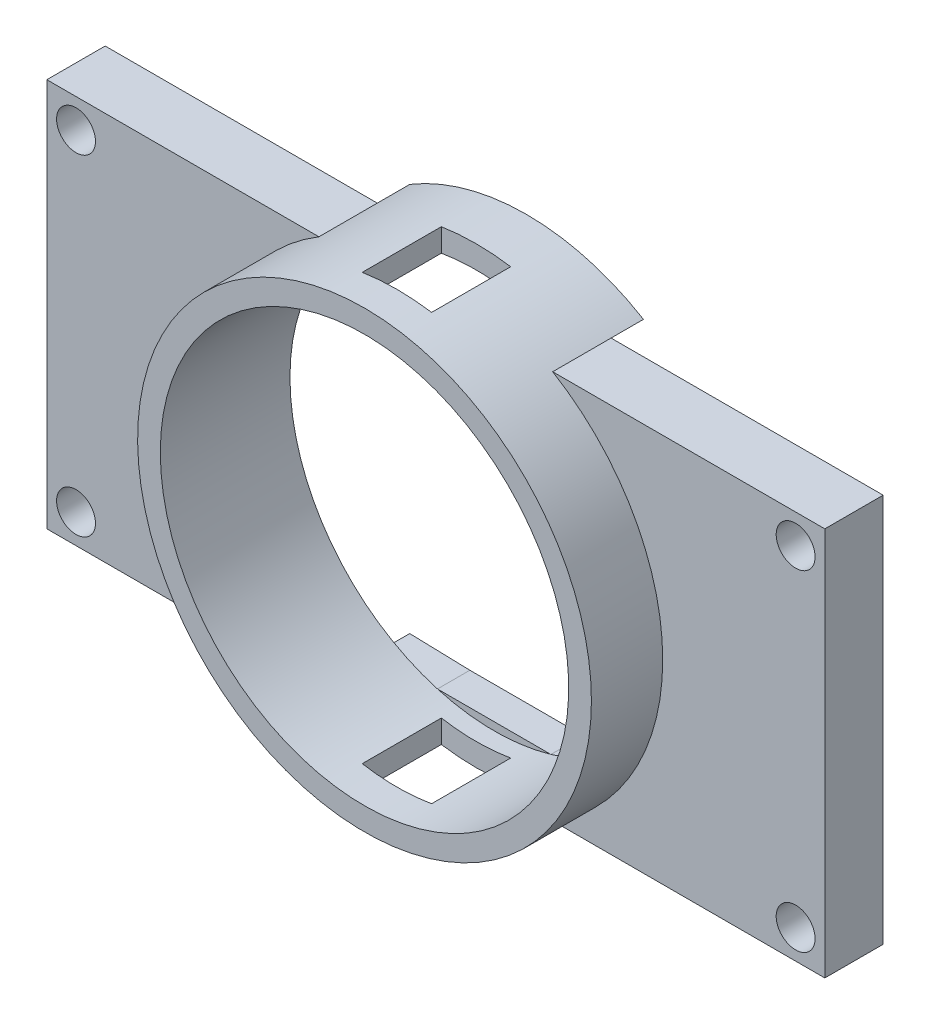
ISO-10303-21;
HEADER;
FILE_DESCRIPTION(('STEP AP214'),'2;1');
FILE_NAME('part.step','',(''),(''),'','','');
FILE_SCHEMA(('AUTOMOTIVE_DESIGN { 1 0 10303 214 1 1 1 1 }'));
ENDSEC;
DATA;
#1=APPLICATION_CONTEXT('core data for automotive mechanical design processes');
#2=APPLICATION_PROTOCOL_DEFINITION('international standard','automotive_design',2000,#1);
#3=PRODUCT_CONTEXT('',#1,'mechanical');
#4=PRODUCT('Part','Part','',(#3));
#5=PRODUCT_RELATED_PRODUCT_CATEGORY('part','',(#4));
#6=PRODUCT_DEFINITION_FORMATION('','',#4);
#7=PRODUCT_DEFINITION_CONTEXT('part definition',#1,'design');
#8=PRODUCT_DEFINITION('design','',#6,#7);
#9=PRODUCT_DEFINITION_SHAPE('','',#8);
#10=(LENGTH_UNIT() NAMED_UNIT(*) SI_UNIT(.MILLI.,.METRE.));
#11=(NAMED_UNIT(*) PLANE_ANGLE_UNIT() SI_UNIT($,.RADIAN.));
#12=(NAMED_UNIT(*) SI_UNIT($,.STERADIAN.) SOLID_ANGLE_UNIT());
#13=UNCERTAINTY_MEASURE_WITH_UNIT(LENGTH_MEASURE(1.E-05),#10,'distance_accuracy_value','');
#14=(GEOMETRIC_REPRESENTATION_CONTEXT(3) GLOBAL_UNCERTAINTY_ASSIGNED_CONTEXT((#13)) GLOBAL_UNIT_ASSIGNED_CONTEXT((#10,
#11,#12)) REPRESENTATION_CONTEXT('',''));
#15=CARTESIAN_POINT('',(0.,0.,0.));
#16=DIRECTION('',(0.,0.,1.));
#17=DIRECTION('',(1.,0.,0.));
#18=AXIS2_PLACEMENT_3D('',#15,#16,#17);
#19=CARTESIAN_POINT('',(1.90004951774991,3.55031798139628,20.));
#20=DIRECTION('',(0.,0.,-1.));
#21=DIRECTION('',(-1.,0.,0.));
#22=AXIS2_PLACEMENT_3D('',#19,#20,#21);
#23=CYLINDRICAL_SURFACE('',#22,35.);
#24=CARTESIAN_POINT('',(1.90004951774991,3.55031798139628,2.79999999999999));
#25=DIRECTION('',(0.,0.,1.));
#26=DIRECTION('',(1.,0.,0.));
#27=AXIS2_PLACEMENT_3D('',#24,#25,#26);
#28=CIRCLE('',#27,35.);
#29=CARTESIAN_POINT('',(7.25004951774991,38.1390083295433,2.79999999999999));
#30=VERTEX_POINT('',#29);
#31=CARTESIAN_POINT('',(-3.44995048225009,38.1390083295433,2.79999999999999));
#32=VERTEX_POINT('',#31);
#33=EDGE_CURVE('E393',#30,#32,#28,.T.);
#34=ORIENTED_EDGE('',*,*,#33,.F.);
#35=DIRECTION('',(0.,0.,-1.));
#36=VECTOR('',#35,1.);
#37=CARTESIAN_POINT('',(7.25004951774991,38.1390083295433,20.));
#38=LINE('',#37,#36);
#39=CARTESIAN_POINT('',(7.25004951774991,38.1390083295433,15.));
#40=VERTEX_POINT('',#39);
#41=EDGE_CURVE('E404',#40,#30,#38,.T.);
#42=ORIENTED_EDGE('',*,*,#41,.F.);
#43=CARTESIAN_POINT('',(1.90004951774991,3.55031798139628,15.));
#44=DIRECTION('',(0.,0.,-1.));
#45=DIRECTION('',(-1.,0.,0.));
#46=AXIS2_PLACEMENT_3D('',#43,#44,#45);
#47=CIRCLE('',#46,35.);
#48=CARTESIAN_POINT('',(-3.44995048225009,38.1390083295433,15.));
#49=VERTEX_POINT('',#48);
#50=EDGE_CURVE('E408',#49,#40,#47,.T.);
#51=ORIENTED_EDGE('',*,*,#50,.F.);
#52=DIRECTION('',(0.,0.,-1.));
#53=VECTOR('',#52,1.);
#54=CARTESIAN_POINT('',(-3.44995048225009,38.1390083295433,20.));
#55=LINE('',#54,#53);
#56=EDGE_CURVE('E412',#32,#49,#55,.F.);
#57=ORIENTED_EDGE('',*,*,#56,.F.);
#58=EDGE_LOOP('',(#34,#42,#51,#57));
#59=FACE_BOUND('',#58,.T.);
#60=DIRECTION('',(0.,0.,-1.));
#61=VECTOR('',#60,1.);
#62=CARTESIAN_POINT('',(19.9278058950699,33.5503179813963,9.));
#63=LINE('',#62,#61);
#64=CARTESIAN_POINT('',(19.9278058950699,33.5503179813963,9.));
#65=VERTEX_POINT('',#64);
#66=CARTESIAN_POINT('',(19.9278058950699,33.5503179813963,0.));
#67=VERTEX_POINT('',#66);
#68=EDGE_CURVE('E248',#65,#67,#63,.T.);
#69=ORIENTED_EDGE('',*,*,#68,.T.);
#70=DIRECTION('',(0.,0.,1.));
#71=VECTOR('',#70,1.);
#72=CARTESIAN_POINT('',(19.9278058950699,33.5503179813963,-5.));
#73=LINE('',#72,#71);
#74=CARTESIAN_POINT('',(19.9278058950699,33.5503179813963,-5.));
#75=VERTEX_POINT('',#74);
#76=EDGE_CURVE('E352',#75,#67,#73,.T.);
#77=ORIENTED_EDGE('',*,*,#76,.F.);
#78=CARTESIAN_POINT('',(1.90004951774991,3.55031798139628,-5.));
#79=DIRECTION('',(0.,0.,-1.));
#80=DIRECTION('',(-1.,0.,0.));
#81=AXIS2_PLACEMENT_3D('',#78,#79,#80);
#82=CIRCLE('',#81,35.);
#83=CARTESIAN_POINT('',(-16.1277068595701,33.5503179813963,-5.));
#84=VERTEX_POINT('',#83);
#85=EDGE_CURVE('E354',#84,#75,#82,.T.);
#86=ORIENTED_EDGE('',*,*,#85,.F.);
#87=DIRECTION('',(0.,0.,1.));
#88=VECTOR('',#87,1.);
#89=CARTESIAN_POINT('',(-16.1277068595701,33.5503179813963,-5.));
#90=LINE('',#89,#88);
#91=CARTESIAN_POINT('',(-16.1277068595701,33.5503179813963,0.));
#92=VERTEX_POINT('',#91);
#93=EDGE_CURVE('E350',#84,#92,#90,.T.);
#94=ORIENTED_EDGE('',*,*,#93,.T.);
#95=DIRECTION('',(0.,0.,-1.));
#96=VECTOR('',#95,1.);
#97=CARTESIAN_POINT('',(-16.1277068595701,33.5503179813963,9.));
#98=LINE('',#97,#96);
#99=CARTESIAN_POINT('',(-16.1277068595701,33.5503179813963,9.));
#100=VERTEX_POINT('',#99);
#101=EDGE_CURVE('E287',#100,#92,#98,.T.);
#102=ORIENTED_EDGE('',*,*,#101,.F.);
#103=CARTESIAN_POINT('',(1.90004951774991,3.55031798139628,9.));
#104=DIRECTION('',(0.,0.,1.));
#105=DIRECTION('',(1.,0.,0.));
#106=AXIS2_PLACEMENT_3D('',#103,#104,#105);
#107=CIRCLE('',#106,35.);
#108=CARTESIAN_POINT('',(-16.1277068595701,-26.4496820186037,9.));
#109=VERTEX_POINT('',#108);
#110=EDGE_CURVE('E318',#100,#109,#107,.T.);
#111=ORIENTED_EDGE('',*,*,#110,.T.);
#112=DIRECTION('',(0.,0.,-1.));
#113=VECTOR('',#112,1.);
#114=CARTESIAN_POINT('',(-16.1277068595701,-26.4496820186037,9.));
#115=LINE('',#114,#113);
#116=CARTESIAN_POINT('',(-16.1277068595701,-26.4496820186037,0.));
#117=VERTEX_POINT('',#116);
#118=EDGE_CURVE('E295',#109,#117,#115,.T.);
#119=ORIENTED_EDGE('',*,*,#118,.T.);
#120=DIRECTION('',(0.,0.,1.));
#121=VECTOR('',#120,1.);
#122=CARTESIAN_POINT('',(-16.1277068595701,-26.4496820186037,-5.));
#123=LINE('',#122,#121);
#124=CARTESIAN_POINT('',(-16.1277068595701,-26.4496820186037,-5.));
#125=VERTEX_POINT('',#124);
#126=EDGE_CURVE('E378',#125,#117,#123,.T.);
#127=ORIENTED_EDGE('',*,*,#126,.F.);
#128=CARTESIAN_POINT('',(1.90004951774991,3.55031798139628,-5.));
#129=DIRECTION('',(0.,0.,-1.));
#130=DIRECTION('',(-1.,0.,0.));
#131=AXIS2_PLACEMENT_3D('',#128,#129,#130);
#132=CIRCLE('',#131,35.);
#133=CARTESIAN_POINT('',(19.9278058950699,-26.4496820186037,-5.));
#134=VERTEX_POINT('',#133);
#135=EDGE_CURVE('E395',#134,#125,#132,.T.);
#136=ORIENTED_EDGE('',*,*,#135,.F.);
#137=DIRECTION('',(0.,0.,1.));
#138=VECTOR('',#137,1.);
#139=CARTESIAN_POINT('',(19.9278058950699,-26.4496820186037,-5.));
#140=LINE('',#139,#138);
#141=CARTESIAN_POINT('',(19.9278058950699,-26.4496820186037,0.));
#142=VERTEX_POINT('',#141);
#143=EDGE_CURVE('E376',#134,#142,#140,.T.);
#144=ORIENTED_EDGE('',*,*,#143,.T.);
#145=DIRECTION('',(0.,0.,-1.));
#146=VECTOR('',#145,1.);
#147=CARTESIAN_POINT('',(19.9278058950699,-26.4496820186037,9.));
#148=LINE('',#147,#146);
#149=CARTESIAN_POINT('',(19.9278058950699,-26.4496820186037,9.));
#150=VERTEX_POINT('',#149);
#151=EDGE_CURVE('E241',#150,#142,#148,.T.);
#152=ORIENTED_EDGE('',*,*,#151,.F.);
#153=CARTESIAN_POINT('',(1.90004951774991,3.55031798139628,9.));
#154=DIRECTION('',(0.,0.,1.));
#155=DIRECTION('',(1.,0.,0.));
#156=AXIS2_PLACEMENT_3D('',#153,#154,#155);
#157=CIRCLE('',#156,35.);
#158=EDGE_CURVE('E271',#150,#65,#157,.T.);
#159=ORIENTED_EDGE('',*,*,#158,.T.);
#160=EDGE_LOOP('',(#69,#77,#86,#94,#102,#111,#119,#127,#136,#144,#152,#159));
#161=FACE_BOUND('',#160,.T.);
#162=CARTESIAN_POINT('',(1.90004951774991,3.55031798139628,20.));
#163=DIRECTION('',(0.,0.,1.));
#164=DIRECTION('',(1.,0.,0.));
#165=AXIS2_PLACEMENT_3D('',#162,#163,#164);
#166=CIRCLE('',#165,35.);
#167=CARTESIAN_POINT('',(36.9000495177499,3.55031798139628,20.));
#168=VERTEX_POINT('',#167);
#169=EDGE_CURVE('E282',#168,#168,#166,.T.);
#170=ORIENTED_EDGE('',*,*,#169,.F.);
#171=EDGE_LOOP('',(#170));
#172=FACE_BOUND('',#171,.T.);
#173=CARTESIAN_POINT('',(-3.44995048225009,-31.0383723667508,2.79999999999999));
#174=VERTEX_POINT('',#173);
#175=CARTESIAN_POINT('',(7.25004951774991,-31.0383723667508,2.79999999999999));
#176=VERTEX_POINT('',#175);
#177=EDGE_CURVE('E402',#174,#176,#28,.T.);
#178=ORIENTED_EDGE('',*,*,#177,.F.);
#179=DIRECTION('',(0.,0.,-1.));
#180=VECTOR('',#179,1.);
#181=CARTESIAN_POINT('',(-3.44995048225009,-31.0383723667508,20.));
#182=LINE('',#181,#180);
#183=CARTESIAN_POINT('',(-3.44995048225009,-31.0383723667508,15.));
#184=VERTEX_POINT('',#183);
#185=EDGE_CURVE('E410',#184,#174,#182,.T.);
#186=ORIENTED_EDGE('',*,*,#185,.F.);
#187=CARTESIAN_POINT('',(7.25004951774991,-31.0383723667508,15.));
#188=VERTEX_POINT('',#187);
#189=EDGE_CURVE('E203',#188,#184,#47,.T.);
#190=ORIENTED_EDGE('',*,*,#189,.F.);
#191=DIRECTION('',(0.,0.,-1.));
#192=VECTOR('',#191,1.);
#193=CARTESIAN_POINT('',(7.25004951774991,-31.0383723667508,20.));
#194=LINE('',#193,#192);
#195=EDGE_CURVE('E406',#176,#188,#194,.F.);
#196=ORIENTED_EDGE('',*,*,#195,.F.);
#197=EDGE_LOOP('',(#178,#186,#190,#196));
#198=FACE_BOUND('',#197,.T.);
#199=ADVANCED_FACE('F41',(#59,#161,#172,#198),#23,.T.);
#200=CARTESIAN_POINT('',(1.90004951774991,3.55031798139628,20.));
#201=DIRECTION('',(0.,0.,-1.));
#202=DIRECTION('',(-1.,0.,0.));
#203=AXIS2_PLACEMENT_3D('',#200,#201,#202);
#204=CYLINDRICAL_SURFACE('',#203,31.5);
#205=CARTESIAN_POINT('',(1.90004951774991,3.55031798139628,2.79999999999999));
#206=DIRECTION('',(0.,0.,1.));
#207=DIRECTION('',(1.,0.,0.));
#208=AXIS2_PLACEMENT_3D('',#205,#206,#207);
#209=CIRCLE('',#208,31.5);
#210=CARTESIAN_POINT('',(-3.44995048225009,34.5926680857296,2.79999999999999));
#211=VERTEX_POINT('',#210);
#212=CARTESIAN_POINT('',(7.25004951774991,34.5926680857296,2.79999999999999));
#213=VERTEX_POINT('',#212);
#214=EDGE_CURVE('E51',#211,#213,#209,.F.);
#215=ORIENTED_EDGE('',*,*,#214,.F.);
#216=DIRECTION('',(0.,0.,-1.));
#217=VECTOR('',#216,1.);
#218=CARTESIAN_POINT('',(-3.44995048225009,34.5926680857296,20.));
#219=LINE('',#218,#217);
#220=CARTESIAN_POINT('',(-3.44995048225009,34.5926680857296,15.));
#221=VERTEX_POINT('',#220);
#222=EDGE_CURVE('E216',#221,#211,#219,.T.);
#223=ORIENTED_EDGE('',*,*,#222,.F.);
#224=CARTESIAN_POINT('',(1.90004951774991,3.55031798139628,15.));
#225=DIRECTION('',(0.,0.,-1.));
#226=DIRECTION('',(-1.,0.,0.));
#227=AXIS2_PLACEMENT_3D('',#224,#225,#226);
#228=CIRCLE('',#227,31.5);
#229=CARTESIAN_POINT('',(7.25004951774991,34.5926680857296,15.));
#230=VERTEX_POINT('',#229);
#231=EDGE_CURVE('E211',#230,#221,#228,.F.);
#232=ORIENTED_EDGE('',*,*,#231,.F.);
#233=DIRECTION('',(0.,0.,-1.));
#234=VECTOR('',#233,1.);
#235=CARTESIAN_POINT('',(7.25004951774991,34.5926680857296,20.));
#236=LINE('',#235,#234);
#237=EDGE_CURVE('E215',#213,#230,#236,.F.);
#238=ORIENTED_EDGE('',*,*,#237,.F.);
#239=EDGE_LOOP('',(#215,#223,#232,#238));
#240=FACE_BOUND('',#239,.T.);
#241=CARTESIAN_POINT('',(1.90004951774991,3.55031798139628,20.));
#242=DIRECTION('',(0.,0.,-1.));
#243=DIRECTION('',(-1.,0.,0.));
#244=AXIS2_PLACEMENT_3D('',#241,#242,#243);
#245=CIRCLE('',#244,31.5);
#246=CARTESIAN_POINT('',(-29.5999504822501,3.55031798139628,20.));
#247=VERTEX_POINT('',#246);
#248=EDGE_CURVE('E334',#247,#247,#245,.T.);
#249=ORIENTED_EDGE('',*,*,#248,.F.);
#250=EDGE_LOOP('',(#249));
#251=FACE_BOUND('',#250,.T.);
#252=CARTESIAN_POINT('',(1.90004951774991,3.55031798139628,0.));
#253=DIRECTION('',(0.,0.,-1.));
#254=DIRECTION('',(-1.,0.,0.));
#255=AXIS2_PLACEMENT_3D('',#252,#253,#254);
#256=CIRCLE('',#255,31.5);
#257=CARTESIAN_POINT('',(-6.84749342993045,33.8113571634615,0.));
#258=VERTEX_POINT('',#257);
#259=CARTESIAN_POINT('',(10.6475924654302,33.8113571634615,0.));
#260=VERTEX_POINT('',#259);
#261=EDGE_CURVE('E337',#258,#260,#256,.T.);
#262=ORIENTED_EDGE('',*,*,#261,.T.);
#263=CARTESIAN_POINT('',(10.6475924654302,-26.710721200669,0.));
#264=VERTEX_POINT('',#263);
#265=EDGE_CURVE('E340',#260,#264,#256,.T.);
#266=ORIENTED_EDGE('',*,*,#265,.T.);
#267=CARTESIAN_POINT('',(-6.84749342993044,-26.710721200669,0.));
#268=VERTEX_POINT('',#267);
#269=EDGE_CURVE('E512',#264,#268,#256,.T.);
#270=ORIENTED_EDGE('',*,*,#269,.T.);
#271=EDGE_CURVE('E341',#268,#258,#256,.T.);
#272=ORIENTED_EDGE('',*,*,#271,.T.);
#273=EDGE_LOOP('',(#262,#266,#270,#272));
#274=FACE_BOUND('',#273,.T.);
#275=CARTESIAN_POINT('',(7.25004951774991,-27.492032122937,2.79999999999999));
#276=VERTEX_POINT('',#275);
#277=CARTESIAN_POINT('',(-3.44995048225009,-27.492032122937,2.79999999999999));
#278=VERTEX_POINT('',#277);
#279=EDGE_CURVE('E11',#276,#278,#209,.F.);
#280=ORIENTED_EDGE('',*,*,#279,.F.);
#281=DIRECTION('',(0.,0.,-1.));
#282=VECTOR('',#281,1.);
#283=CARTESIAN_POINT('',(7.25004951774991,-27.492032122937,20.));
#284=LINE('',#283,#282);
#285=CARTESIAN_POINT('',(7.25004951774991,-27.492032122937,15.));
#286=VERTEX_POINT('',#285);
#287=EDGE_CURVE('E45',#286,#276,#284,.T.);
#288=ORIENTED_EDGE('',*,*,#287,.F.);
#289=CARTESIAN_POINT('',(-3.44995048225009,-27.492032122937,15.));
#290=VERTEX_POINT('',#289);
#291=EDGE_CURVE('E197',#290,#286,#228,.F.);
#292=ORIENTED_EDGE('',*,*,#291,.F.);
#293=DIRECTION('',(0.,0.,-1.));
#294=VECTOR('',#293,1.);
#295=CARTESIAN_POINT('',(-3.44995048225009,-27.492032122937,20.));
#296=LINE('',#295,#294);
#297=EDGE_CURVE('E190',#278,#290,#296,.F.);
#298=ORIENTED_EDGE('',*,*,#297,.F.);
#299=EDGE_LOOP('',(#280,#288,#292,#298));
#300=FACE_BOUND('',#299,.T.);
#301=ADVANCED_FACE('F209',(#240,#251,#274,#300),#204,.F.);
#302=CARTESIAN_POINT('',(0.,0.,0.));
#303=DIRECTION('',(0.,0.,1.));
#304=DIRECTION('',(1.,0.,0.));
#305=AXIS2_PLACEMENT_3D('',#302,#303,#304);
#306=PLANE('',#305);
#307=CARTESIAN_POINT('',(-53.5999504822501,-21.9496820186037,0.));
#308=DIRECTION('',(0.,0.,1.));
#309=DIRECTION('',(1.,0.,0.));
#310=AXIS2_PLACEMENT_3D('',#307,#308,#309);
#311=CIRCLE('',#310,1.5);
#312=CARTESIAN_POINT('',(-52.0999504822501,-21.9496820186037,0.));
#313=VERTEX_POINT('',#312);
#314=EDGE_CURVE('E331',#313,#313,#311,.T.);
#315=ORIENTED_EDGE('',*,*,#314,.T.);
#316=EDGE_LOOP('',(#315));
#317=FACE_BOUND('',#316,.T.);
#318=CARTESIAN_POINT('',(-53.5999504822501,29.0503179813963,0.));
#319=DIRECTION('',(0.,0.,1.));
#320=DIRECTION('',(1.,0.,0.));
#321=AXIS2_PLACEMENT_3D('',#318,#319,#320);
#322=CIRCLE('',#321,1.5);
#323=CARTESIAN_POINT('',(-52.0999504822501,29.0503179813963,0.));
#324=VERTEX_POINT('',#323);
#325=EDGE_CURVE('E325',#324,#324,#322,.T.);
#326=ORIENTED_EDGE('',*,*,#325,.T.);
#327=EDGE_LOOP('',(#326));
#328=FACE_BOUND('',#327,.T.);
#329=DIRECTION('',(0.999604626230671,-0.0281174539786441,0.));
#330=VECTOR('',#329,1.);
#331=CARTESIAN_POINT('',(-0.756154101751829,-26.8820618975145,0.));
#332=LINE('',#331,#330);
#333=EDGE_CURVE('E384',#117,#268,#332,.T.);
#334=ORIENTED_EDGE('',*,*,#333,.F.);
#335=DIRECTION('',(1.,0.,0.));
#336=VECTOR('',#335,1.);
#337=CARTESIAN_POINT('',(0.,-26.4496820186037,0.));
#338=LINE('',#337,#336);
#339=CARTESIAN_POINT('',(-58.0999504822501,-26.4496820186037,0.));
#340=VERTEX_POINT('',#339);
#341=EDGE_CURVE('E299',#340,#117,#338,.T.);
#342=ORIENTED_EDGE('',*,*,#341,.F.);
#343=DIRECTION('',(0.,-1.,0.));
#344=VECTOR('',#343,1.);
#345=CARTESIAN_POINT('',(-58.0999504822501,0.,0.));
#346=LINE('',#345,#344);
#347=CARTESIAN_POINT('',(-58.0999504822501,33.5503179813963,0.));
#348=VERTEX_POINT('',#347);
#349=EDGE_CURVE('E303',#348,#340,#346,.T.);
#350=ORIENTED_EDGE('',*,*,#349,.F.);
#351=DIRECTION('',(1.,0.,0.));
#352=VECTOR('',#351,1.);
#353=CARTESIAN_POINT('',(0.,33.5503179813963,0.));
#354=LINE('',#353,#352);
#355=EDGE_CURVE('E306',#348,#92,#354,.T.);
#356=ORIENTED_EDGE('',*,*,#355,.T.);
#357=DIRECTION('',(0.999604626230671,0.0281174539786441,0.));
#358=VECTOR('',#357,1.);
#359=CARTESIAN_POINT('',(-0.955726969568096,33.9770841598709,0.));
#360=LINE('',#359,#358);
#361=EDGE_CURVE('E355',#92,#258,#360,.T.);
#362=ORIENTED_EDGE('',*,*,#361,.T.);
#363=ORIENTED_EDGE('',*,*,#271,.F.);
#364=EDGE_LOOP('',(#334,#342,#350,#356,#362,#363));
#365=FACE_BOUND('',#364,.T.);
#366=ADVANCED_FACE('F438',(#317,#328,#365),#306,.F.);
#367=CARTESIAN_POINT('',(57.4000495177499,29.0503179813963,0.));
#368=DIRECTION('',(0.,0.,1.));
#369=DIRECTION('',(1.,0.,0.));
#370=AXIS2_PLACEMENT_3D('',#367,#368,#369);
#371=CIRCLE('',#370,1.5);
#372=CARTESIAN_POINT('',(58.9000495177499,29.0503179813963,0.));
#373=VERTEX_POINT('',#372);
#374=EDGE_CURVE('E279',#373,#373,#371,.T.);
#375=ORIENTED_EDGE('',*,*,#374,.T.);
#376=EDGE_LOOP('',(#375));
#377=FACE_BOUND('',#376,.T.);
#378=CARTESIAN_POINT('',(57.4000495177499,-21.9496820186037,0.));
#379=DIRECTION('',(0.,0.,1.));
#380=DIRECTION('',(1.,0.,0.));
#381=AXIS2_PLACEMENT_3D('',#378,#379,#380);
#382=CIRCLE('',#381,1.5);
#383=CARTESIAN_POINT('',(58.9000495177499,-21.9496820186037,0.));
#384=VERTEX_POINT('',#383);
#385=EDGE_CURVE('E233',#384,#384,#382,.T.);
#386=ORIENTED_EDGE('',*,*,#385,.T.);
#387=EDGE_LOOP('',(#386));
#388=FACE_BOUND('',#387,.T.);
#389=DIRECTION('',(-1.,0.,0.));
#390=VECTOR('',#389,1.);
#391=CARTESIAN_POINT('',(0.,-26.4496820186037,0.));
#392=LINE('',#391,#390);
#393=CARTESIAN_POINT('',(61.9000495177499,-26.4496820186037,0.));
#394=VERTEX_POINT('',#393);
#395=EDGE_CURVE('E259',#394,#142,#392,.T.);
#396=ORIENTED_EDGE('',*,*,#395,.T.);
#397=DIRECTION('',(-0.999604626230671,-0.0281174539786448,0.));
#398=VECTOR('',#397,1.);
#399=CARTESIAN_POINT('',(0.759158426677761,-26.9888687619242,0.));
#400=LINE('',#399,#398);
#401=EDGE_CURVE('E388',#142,#264,#400,.T.);
#402=ORIENTED_EDGE('',*,*,#401,.T.);
#403=ORIENTED_EDGE('',*,*,#265,.F.);
#404=DIRECTION('',(-0.999604626230671,0.0281174539786448,0.));
#405=VECTOR('',#404,1.);
#406=CARTESIAN_POINT('',(0.958731294494033,34.0838910242806,0.));
#407=LINE('',#406,#405);
#408=EDGE_CURVE('E362',#67,#260,#407,.T.);
#409=ORIENTED_EDGE('',*,*,#408,.F.);
#410=DIRECTION('',(-1.,0.,0.));
#411=VECTOR('',#410,1.);
#412=CARTESIAN_POINT('',(0.,33.5503179813963,0.));
#413=LINE('',#412,#411);
#414=CARTESIAN_POINT('',(61.9000495177499,33.5503179813963,0.));
#415=VERTEX_POINT('',#414);
#416=EDGE_CURVE('E252',#415,#67,#413,.T.);
#417=ORIENTED_EDGE('',*,*,#416,.F.);
#418=DIRECTION('',(0.,-1.,0.));
#419=VECTOR('',#418,1.);
#420=CARTESIAN_POINT('',(61.9000495177499,0.,0.));
#421=LINE('',#420,#419);
#422=EDGE_CURVE('E256',#415,#394,#421,.T.);
#423=ORIENTED_EDGE('',*,*,#422,.T.);
#424=EDGE_LOOP('',(#396,#402,#403,#409,#417,#423));
#425=FACE_BOUND('',#424,.T.);
#426=ADVANCED_FACE('F490',(#377,#388,#425),#306,.F.);
#427=CARTESIAN_POINT('',(57.4000495177499,-21.9496820186037,4.));
#428=DIRECTION('',(0.,0.,-1.));
#429=DIRECTION('',(-1.,0.,0.));
#430=AXIS2_PLACEMENT_3D('',#427,#428,#429);
#431=CYLINDRICAL_SURFACE('',#430,1.5);
#432=CARTESIAN_POINT('',(57.4000495177499,-21.9496820186037,4.));
#433=DIRECTION('',(0.,0.,1.));
#434=DIRECTION('',(1.,0.,0.));
#435=AXIS2_PLACEMENT_3D('',#432,#433,#434);
#436=CIRCLE('',#435,1.5);
#437=CARTESIAN_POINT('',(58.9000495177499,-21.9496820186037,4.));
#438=VERTEX_POINT('',#437);
#439=EDGE_CURVE('E232',#438,#438,#436,.T.);
#440=ORIENTED_EDGE('',*,*,#439,.T.);
#441=EDGE_LOOP('',(#440));
#442=FACE_BOUND('',#441,.T.);
#443=ORIENTED_EDGE('',*,*,#385,.F.);
#444=EDGE_LOOP('',(#443));
#445=FACE_BOUND('',#444,.T.);
#446=ADVANCED_FACE('F43',(#442,#445),#431,.F.);
#447=CARTESIAN_POINT('',(0.,0.,4.));
#448=DIRECTION('',(0.,0.,1.));
#449=DIRECTION('',(1.,0.,0.));
#450=AXIS2_PLACEMENT_3D('',#447,#448,#449);
#451=PLANE('',#450);
#452=ORIENTED_EDGE('',*,*,#439,.F.);
#453=EDGE_LOOP('',(#452));
#454=FACE_BOUND('',#453,.T.);
#455=CARTESIAN_POINT('',(57.4000495177499,-21.9496820186037,4.));
#456=DIRECTION('',(0.,0.,1.));
#457=DIRECTION('',(1.,0.,0.));
#458=AXIS2_PLACEMENT_3D('',#455,#456,#457);
#459=CIRCLE('',#458,3.);
#460=CARTESIAN_POINT('',(60.4000495177499,-21.9496820186037,4.));
#461=VERTEX_POINT('',#460);
#462=EDGE_CURVE('E236',#461,#461,#459,.F.);
#463=ORIENTED_EDGE('',*,*,#462,.F.);
#464=EDGE_LOOP('',(#463));
#465=FACE_BOUND('',#464,.T.);
#466=ADVANCED_FACE('F553',(#454,#465),#451,.T.);
#467=CARTESIAN_POINT('',(0.,-26.4496820186037,9.));
#468=DIRECTION('',(0.,-1.,0.));
#469=DIRECTION('',(0.,0.,-1.));
#470=AXIS2_PLACEMENT_3D('',#467,#468,#469);
#471=PLANE('',#470);
#472=ORIENTED_EDGE('',*,*,#395,.F.);
#473=DIRECTION('',(0.,0.,-1.));
#474=VECTOR('',#473,1.);
#475=CARTESIAN_POINT('',(61.9000495177499,-26.4496820186037,9.));
#476=LINE('',#475,#474);
#477=CARTESIAN_POINT('',(61.9000495177499,-26.4496820186037,9.));
#478=VERTEX_POINT('',#477);
#479=EDGE_CURVE('E244',#478,#394,#476,.T.);
#480=ORIENTED_EDGE('',*,*,#479,.F.);
#481=DIRECTION('',(-1.,0.,0.));
#482=VECTOR('',#481,1.);
#483=CARTESIAN_POINT('',(0.,-26.4496820186037,9.));
#484=LINE('',#483,#482);
#485=EDGE_CURVE('E268',#478,#150,#484,.T.);
#486=ORIENTED_EDGE('',*,*,#485,.T.);
#487=ORIENTED_EDGE('',*,*,#151,.T.);
#488=EDGE_LOOP('',(#472,#480,#486,#487));
#489=FACE_BOUND('',#488,.T.);
#490=ADVANCED_FACE('F487',(#489),#471,.T.);
#491=CARTESIAN_POINT('',(61.9000495177499,0.,9.));
#492=DIRECTION('',(1.,0.,0.));
#493=DIRECTION('',(0.,1.,0.));
#494=AXIS2_PLACEMENT_3D('',#491,#492,#493);
#495=PLANE('',#494);
#496=ORIENTED_EDGE('',*,*,#422,.F.);
#497=DIRECTION('',(0.,0.,-1.));
#498=VECTOR('',#497,1.);
#499=CARTESIAN_POINT('',(61.9000495177499,33.5503179813963,9.));
#500=LINE('',#499,#498);
#501=CARTESIAN_POINT('',(61.9000495177499,33.5503179813963,9.));
#502=VERTEX_POINT('',#501);
#503=EDGE_CURVE('E246',#502,#415,#500,.T.);
#504=ORIENTED_EDGE('',*,*,#503,.F.);
#505=DIRECTION('',(0.,-1.,0.));
#506=VECTOR('',#505,1.);
#507=CARTESIAN_POINT('',(61.9000495177499,0.,9.));
#508=LINE('',#507,#506);
#509=EDGE_CURVE('E265',#502,#478,#508,.T.);
#510=ORIENTED_EDGE('',*,*,#509,.T.);
#511=ORIENTED_EDGE('',*,*,#479,.T.);
#512=EDGE_LOOP('',(#496,#504,#510,#511));
#513=FACE_BOUND('',#512,.T.);
#514=ADVANCED_FACE('F495',(#513),#495,.T.);
#515=CARTESIAN_POINT('',(57.4000495177499,29.0503179813963,9.));
#516=DIRECTION('',(0.,0.,-1.));
#517=DIRECTION('',(-1.,0.,0.));
#518=AXIS2_PLACEMENT_3D('',#515,#516,#517);
#519=CYLINDRICAL_SURFACE('',#518,3.);
#520=CARTESIAN_POINT('',(57.4000495177499,29.0503179813963,4.));
#521=DIRECTION('',(0.,0.,1.));
#522=DIRECTION('',(1.,0.,0.));
#523=AXIS2_PLACEMENT_3D('',#520,#521,#522);
#524=CIRCLE('',#523,3.);
#525=CARTESIAN_POINT('',(60.4000495177499,29.0503179813963,4.));
#526=VERTEX_POINT('',#525);
#527=EDGE_CURVE('E229',#526,#526,#524,.T.);
#528=ORIENTED_EDGE('',*,*,#527,.F.);
#529=EDGE_LOOP('',(#528));
#530=FACE_BOUND('',#529,.T.);
#531=CARTESIAN_POINT('',(57.4000495177499,29.0503179813963,9.));
#532=DIRECTION('',(0.,0.,1.));
#533=DIRECTION('',(1.,0.,0.));
#534=AXIS2_PLACEMENT_3D('',#531,#532,#533);
#535=CIRCLE('',#534,3.);
#536=CARTESIAN_POINT('',(60.4000495177499,29.0503179813963,9.));
#537=VERTEX_POINT('',#536);
#538=EDGE_CURVE('E274',#537,#537,#535,.T.);
#539=ORIENTED_EDGE('',*,*,#538,.T.);
#540=EDGE_LOOP('',(#539));
#541=FACE_BOUND('',#540,.T.);
#542=ADVANCED_FACE('F550',(#530,#541),#519,.F.);
#543=CARTESIAN_POINT('',(57.4000495177499,-21.9496820186037,9.));
#544=DIRECTION('',(0.,0.,-1.));
#545=DIRECTION('',(-1.,0.,0.));
#546=AXIS2_PLACEMENT_3D('',#543,#544,#545);
#547=CYLINDRICAL_SURFACE('',#546,3.);
#548=ORIENTED_EDGE('',*,*,#462,.T.);
#549=EDGE_LOOP('',(#548));
#550=FACE_BOUND('',#549,.T.);
#551=CARTESIAN_POINT('',(57.4000495177499,-21.9496820186037,9.));
#552=DIRECTION('',(0.,0.,1.));
#553=DIRECTION('',(1.,0.,0.));
#554=AXIS2_PLACEMENT_3D('',#551,#552,#553);
#555=CIRCLE('',#554,3.);
#556=CARTESIAN_POINT('',(60.4000495177499,-21.9496820186037,9.));
#557=VERTEX_POINT('',#556);
#558=EDGE_CURVE('E255',#557,#557,#555,.T.);
#559=ORIENTED_EDGE('',*,*,#558,.T.);
#560=EDGE_LOOP('',(#559));
#561=FACE_BOUND('',#560,.T.);
#562=ADVANCED_FACE('F547',(#550,#561),#547,.F.);
#563=CARTESIAN_POINT('',(0.,33.5503179813963,9.));
#564=DIRECTION('',(0.,-1.,0.));
#565=DIRECTION('',(0.,0.,-1.));
#566=AXIS2_PLACEMENT_3D('',#563,#564,#565);
#567=PLANE('',#566);
#568=ORIENTED_EDGE('',*,*,#416,.T.);
#569=ORIENTED_EDGE('',*,*,#68,.F.);
#570=DIRECTION('',(-1.,0.,0.));
#571=VECTOR('',#570,1.);
#572=CARTESIAN_POINT('',(0.,33.5503179813963,9.));
#573=LINE('',#572,#571);
#574=EDGE_CURVE('E251',#502,#65,#573,.T.);
#575=ORIENTED_EDGE('',*,*,#574,.F.);
#576=ORIENTED_EDGE('',*,*,#503,.T.);
#577=EDGE_LOOP('',(#568,#569,#575,#576));
#578=FACE_BOUND('',#577,.T.);
#579=ADVANCED_FACE('F501',(#578),#567,.F.);
#580=CARTESIAN_POINT('',(0.,0.,9.));
#581=DIRECTION('',(0.,0.,1.));
#582=DIRECTION('',(1.,0.,0.));
#583=AXIS2_PLACEMENT_3D('',#580,#581,#582);
#584=PLANE('',#583);
#585=ORIENTED_EDGE('',*,*,#558,.F.);
#586=EDGE_LOOP('',(#585));
#587=FACE_BOUND('',#586,.T.);
#588=ORIENTED_EDGE('',*,*,#538,.F.);
#589=EDGE_LOOP('',(#588));
#590=FACE_BOUND('',#589,.T.);
#591=ORIENTED_EDGE('',*,*,#158,.F.);
#592=ORIENTED_EDGE('',*,*,#485,.F.);
#593=ORIENTED_EDGE('',*,*,#509,.F.);
#594=ORIENTED_EDGE('',*,*,#574,.T.);
#595=EDGE_LOOP('',(#591,#592,#593,#594));
#596=FACE_BOUND('',#595,.T.);
#597=ADVANCED_FACE('F499',(#587,#590,#596),#584,.T.);
#598=CARTESIAN_POINT('',(57.4000495177499,29.0503179813963,4.));
#599=DIRECTION('',(0.,0.,-1.));
#600=DIRECTION('',(-1.,0.,0.));
#601=AXIS2_PLACEMENT_3D('',#598,#599,#600);
#602=CYLINDRICAL_SURFACE('',#601,1.5);
#603=CARTESIAN_POINT('',(57.4000495177499,29.0503179813963,4.));
#604=DIRECTION('',(0.,0.,1.));
#605=DIRECTION('',(1.,0.,0.));
#606=AXIS2_PLACEMENT_3D('',#603,#604,#605);
#607=CIRCLE('',#606,1.5);
#608=CARTESIAN_POINT('',(58.9000495177499,29.0503179813963,4.));
#609=VERTEX_POINT('',#608);
#610=EDGE_CURVE('E262',#609,#609,#607,.T.);
#611=ORIENTED_EDGE('',*,*,#610,.T.);
#612=EDGE_LOOP('',(#611));
#613=FACE_BOUND('',#612,.T.);
#614=ORIENTED_EDGE('',*,*,#374,.F.);
#615=EDGE_LOOP('',(#614));
#616=FACE_BOUND('',#615,.T.);
#617=ADVANCED_FACE('F537',(#613,#616),#602,.F.);
#618=CARTESIAN_POINT('',(0.,0.,4.));
#619=DIRECTION('',(0.,0.,1.));
#620=DIRECTION('',(1.,0.,0.));
#621=AXIS2_PLACEMENT_3D('',#618,#619,#620);
#622=PLANE('',#621);
#623=ORIENTED_EDGE('',*,*,#610,.F.);
#624=EDGE_LOOP('',(#623));
#625=FACE_BOUND('',#624,.T.);
#626=ORIENTED_EDGE('',*,*,#527,.T.);
#627=EDGE_LOOP('',(#626));
#628=FACE_BOUND('',#627,.T.);
#629=ADVANCED_FACE('F534',(#625,#628),#622,.T.);
#630=CARTESIAN_POINT('',(0.,0.,20.));
#631=DIRECTION('',(0.,0.,1.));
#632=DIRECTION('',(1.,0.,0.));
#633=AXIS2_PLACEMENT_3D('',#630,#631,#632);
#634=PLANE('',#633);
#635=ORIENTED_EDGE('',*,*,#169,.T.);
#636=EDGE_LOOP('',(#635));
#637=FACE_BOUND('',#636,.T.);
#638=ORIENTED_EDGE('',*,*,#248,.T.);
#639=EDGE_LOOP('',(#638));
#640=FACE_BOUND('',#639,.T.);
#641=ADVANCED_FACE('F532',(#637,#640),#634,.T.);
#642=CARTESIAN_POINT('',(0.,33.5503179813963,9.));
#643=DIRECTION('',(0.,1.,0.));
#644=DIRECTION('',(0.,0.,1.));
#645=AXIS2_PLACEMENT_3D('',#642,#643,#644);
#646=PLANE('',#645);
#647=ORIENTED_EDGE('',*,*,#355,.F.);
#648=DIRECTION('',(0.,0.,-1.));
#649=VECTOR('',#648,1.);
#650=CARTESIAN_POINT('',(-58.0999504822501,33.5503179813963,9.));
#651=LINE('',#650,#649);
#652=CARTESIAN_POINT('',(-58.0999504822501,33.5503179813963,9.));
#653=VERTEX_POINT('',#652);
#654=EDGE_CURVE('E290',#653,#348,#651,.T.);
#655=ORIENTED_EDGE('',*,*,#654,.F.);
#656=DIRECTION('',(1.,0.,0.));
#657=VECTOR('',#656,1.);
#658=CARTESIAN_POINT('',(0.,33.5503179813963,9.));
#659=LINE('',#658,#657);
#660=EDGE_CURVE('E315',#653,#100,#659,.T.);
#661=ORIENTED_EDGE('',*,*,#660,.T.);
#662=ORIENTED_EDGE('',*,*,#101,.T.);
#663=EDGE_LOOP('',(#647,#655,#661,#662));
#664=FACE_BOUND('',#663,.T.);
#665=ADVANCED_FACE('F459',(#664),#646,.T.);
#666=CARTESIAN_POINT('',(-58.0999504822501,0.,9.));
#667=DIRECTION('',(1.,0.,0.));
#668=DIRECTION('',(0.,1.,0.));
#669=AXIS2_PLACEMENT_3D('',#666,#667,#668);
#670=PLANE('',#669);
#671=ORIENTED_EDGE('',*,*,#349,.T.);
#672=DIRECTION('',(0.,0.,-1.));
#673=VECTOR('',#672,1.);
#674=CARTESIAN_POINT('',(-58.0999504822501,-26.4496820186037,9.));
#675=LINE('',#674,#673);
#676=CARTESIAN_POINT('',(-58.0999504822501,-26.4496820186037,9.));
#677=VERTEX_POINT('',#676);
#678=EDGE_CURVE('E292',#677,#340,#675,.T.);
#679=ORIENTED_EDGE('',*,*,#678,.F.);
#680=DIRECTION('',(0.,-1.,0.));
#681=VECTOR('',#680,1.);
#682=CARTESIAN_POINT('',(-58.0999504822501,0.,9.));
#683=LINE('',#682,#681);
#684=EDGE_CURVE('E312',#653,#677,#683,.T.);
#685=ORIENTED_EDGE('',*,*,#684,.F.);
#686=ORIENTED_EDGE('',*,*,#654,.T.);
#687=EDGE_LOOP('',(#671,#679,#685,#686));
#688=FACE_BOUND('',#687,.T.);
#689=ADVANCED_FACE('F600',(#688),#670,.F.);
#690=CARTESIAN_POINT('',(-53.5999504822501,-21.9496820186037,9.));
#691=DIRECTION('',(0.,0.,-1.));
#692=DIRECTION('',(-1.,0.,0.));
#693=AXIS2_PLACEMENT_3D('',#690,#691,#692);
#694=CYLINDRICAL_SURFACE('',#693,3.);
#695=CARTESIAN_POINT('',(-53.5999504822501,-21.9496820186037,4.));
#696=DIRECTION('',(0.,0.,1.));
#697=DIRECTION('',(1.,0.,0.));
#698=AXIS2_PLACEMENT_3D('',#695,#696,#697);
#699=CIRCLE('',#698,3.);
#700=CARTESIAN_POINT('',(-50.5999504822501,-21.9496820186037,4.));
#701=VERTEX_POINT('',#700);
#702=EDGE_CURVE('E222',#701,#701,#699,.T.);
#703=ORIENTED_EDGE('',*,*,#702,.F.);
#704=EDGE_LOOP('',(#703));
#705=FACE_BOUND('',#704,.T.);
#706=CARTESIAN_POINT('',(-53.5999504822501,-21.9496820186037,9.));
#707=DIRECTION('',(0.,0.,1.));
#708=DIRECTION('',(1.,0.,0.));
#709=AXIS2_PLACEMENT_3D('',#706,#707,#708);
#710=CIRCLE('',#709,3.);
#711=CARTESIAN_POINT('',(-50.5999504822501,-21.9496820186037,9.));
#712=VERTEX_POINT('',#711);
#713=EDGE_CURVE('E320',#712,#712,#710,.T.);
#714=ORIENTED_EDGE('',*,*,#713,.T.);
#715=EDGE_LOOP('',(#714));
#716=FACE_BOUND('',#715,.T.);
#717=ADVANCED_FACE('F603',(#705,#716),#694,.F.);
#718=CARTESIAN_POINT('',(-53.5999504822501,29.0503179813963,9.));
#719=DIRECTION('',(0.,0.,-1.));
#720=DIRECTION('',(-1.,0.,0.));
#721=AXIS2_PLACEMENT_3D('',#718,#719,#720);
#722=CYLINDRICAL_SURFACE('',#721,3.);
#723=CARTESIAN_POINT('',(-53.5999504822501,29.0503179813963,4.));
#724=DIRECTION('',(0.,0.,1.));
#725=DIRECTION('',(1.,0.,0.));
#726=AXIS2_PLACEMENT_3D('',#723,#724,#725);
#727=CIRCLE('',#726,3.);
#728=CARTESIAN_POINT('',(-50.5999504822501,29.0503179813963,4.));
#729=VERTEX_POINT('',#728);
#730=EDGE_CURVE('E224',#729,#729,#727,.T.);
#731=ORIENTED_EDGE('',*,*,#730,.F.);
#732=EDGE_LOOP('',(#731));
#733=FACE_BOUND('',#732,.T.);
#734=CARTESIAN_POINT('',(-53.5999504822501,29.0503179813963,9.));
#735=DIRECTION('',(0.,0.,1.));
#736=DIRECTION('',(1.,0.,0.));
#737=AXIS2_PLACEMENT_3D('',#734,#735,#736);
#738=CIRCLE('',#737,3.);
#739=CARTESIAN_POINT('',(-50.5999504822501,29.0503179813963,9.));
#740=VERTEX_POINT('',#739);
#741=EDGE_CURVE('E302',#740,#740,#738,.T.);
#742=ORIENTED_EDGE('',*,*,#741,.T.);
#743=EDGE_LOOP('',(#742));
#744=FACE_BOUND('',#743,.T.);
#745=ADVANCED_FACE('F599',(#733,#744),#722,.F.);
#746=CARTESIAN_POINT('',(0.,-26.4496820186037,9.));
#747=DIRECTION('',(0.,1.,0.));
#748=DIRECTION('',(0.,0.,1.));
#749=AXIS2_PLACEMENT_3D('',#746,#747,#748);
#750=PLANE('',#749);
#751=ORIENTED_EDGE('',*,*,#341,.T.);
#752=ORIENTED_EDGE('',*,*,#118,.F.);
#753=DIRECTION('',(1.,0.,0.));
#754=VECTOR('',#753,1.);
#755=CARTESIAN_POINT('',(0.,-26.4496820186037,9.));
#756=LINE('',#755,#754);
#757=EDGE_CURVE('E298',#677,#109,#756,.T.);
#758=ORIENTED_EDGE('',*,*,#757,.F.);
#759=ORIENTED_EDGE('',*,*,#678,.T.);
#760=EDGE_LOOP('',(#751,#752,#758,#759));
#761=FACE_BOUND('',#760,.T.);
#762=ADVANCED_FACE('F469',(#761),#750,.F.);
#763=CARTESIAN_POINT('',(0.,0.,9.));
#764=DIRECTION('',(0.,0.,1.));
#765=DIRECTION('',(1.,0.,0.));
#766=AXIS2_PLACEMENT_3D('',#763,#764,#765);
#767=PLANE('',#766);
#768=ORIENTED_EDGE('',*,*,#741,.F.);
#769=EDGE_LOOP('',(#768));
#770=FACE_BOUND('',#769,.T.);
#771=ORIENTED_EDGE('',*,*,#713,.F.);
#772=EDGE_LOOP('',(#771));
#773=FACE_BOUND('',#772,.T.);
#774=ORIENTED_EDGE('',*,*,#110,.F.);
#775=ORIENTED_EDGE('',*,*,#660,.F.);
#776=ORIENTED_EDGE('',*,*,#684,.T.);
#777=ORIENTED_EDGE('',*,*,#757,.T.);
#778=EDGE_LOOP('',(#774,#775,#776,#777));
#779=FACE_BOUND('',#778,.T.);
#780=ADVANCED_FACE('F464',(#770,#773,#779),#767,.T.);
#781=CARTESIAN_POINT('',(-53.5999504822501,29.0503179813963,4.));
#782=DIRECTION('',(0.,0.,-1.));
#783=DIRECTION('',(-1.,0.,0.));
#784=AXIS2_PLACEMENT_3D('',#781,#782,#783);
#785=CYLINDRICAL_SURFACE('',#784,1.5);
#786=CARTESIAN_POINT('',(-53.5999504822501,29.0503179813963,4.));
#787=DIRECTION('',(0.,0.,1.));
#788=DIRECTION('',(1.,0.,0.));
#789=AXIS2_PLACEMENT_3D('',#786,#787,#788);
#790=CIRCLE('',#789,1.5);
#791=CARTESIAN_POINT('',(-52.0999504822501,29.0503179813963,4.));
#792=VERTEX_POINT('',#791);
#793=EDGE_CURVE('E309',#792,#792,#790,.T.);
#794=ORIENTED_EDGE('',*,*,#793,.T.);
#795=EDGE_LOOP('',(#794));
#796=FACE_BOUND('',#795,.T.);
#797=ORIENTED_EDGE('',*,*,#325,.F.);
#798=EDGE_LOOP('',(#797));
#799=FACE_BOUND('',#798,.T.);
#800=ADVANCED_FACE('F581',(#796,#799),#785,.F.);
#801=CARTESIAN_POINT('',(0.,0.,4.));
#802=DIRECTION('',(0.,0.,1.));
#803=DIRECTION('',(1.,0.,0.));
#804=AXIS2_PLACEMENT_3D('',#801,#802,#803);
#805=PLANE('',#804);
#806=ORIENTED_EDGE('',*,*,#793,.F.);
#807=EDGE_LOOP('',(#806));
#808=FACE_BOUND('',#807,.T.);
#809=ORIENTED_EDGE('',*,*,#730,.T.);
#810=EDGE_LOOP('',(#809));
#811=FACE_BOUND('',#810,.T.);
#812=ADVANCED_FACE('F583',(#808,#811),#805,.T.);
#813=CARTESIAN_POINT('',(-53.5999504822501,-21.9496820186037,4.));
#814=DIRECTION('',(0.,0.,-1.));
#815=DIRECTION('',(-1.,0.,0.));
#816=AXIS2_PLACEMENT_3D('',#813,#814,#815);
#817=CYLINDRICAL_SURFACE('',#816,1.5);
#818=CARTESIAN_POINT('',(-53.5999504822501,-21.9496820186037,4.));
#819=DIRECTION('',(0.,0.,1.));
#820=DIRECTION('',(1.,0.,0.));
#821=AXIS2_PLACEMENT_3D('',#818,#819,#820);
#822=CIRCLE('',#821,1.5);
#823=CARTESIAN_POINT('',(-52.0999504822501,-21.9496820186037,4.));
#824=VERTEX_POINT('',#823);
#825=EDGE_CURVE('E328',#824,#824,#822,.T.);
#826=ORIENTED_EDGE('',*,*,#825,.T.);
#827=EDGE_LOOP('',(#826));
#828=FACE_BOUND('',#827,.T.);
#829=ORIENTED_EDGE('',*,*,#314,.F.);
#830=EDGE_LOOP('',(#829));
#831=FACE_BOUND('',#830,.T.);
#832=ADVANCED_FACE('F590',(#828,#831),#817,.F.);
#833=CARTESIAN_POINT('',(0.,0.,4.));
#834=DIRECTION('',(0.,0.,1.));
#835=DIRECTION('',(1.,0.,0.));
#836=AXIS2_PLACEMENT_3D('',#833,#834,#835);
#837=PLANE('',#836);
#838=ORIENTED_EDGE('',*,*,#825,.F.);
#839=EDGE_LOOP('',(#838));
#840=FACE_BOUND('',#839,.T.);
#841=ORIENTED_EDGE('',*,*,#702,.T.);
#842=EDGE_LOOP('',(#841));
#843=FACE_BOUND('',#842,.T.);
#844=ADVANCED_FACE('F654',(#840,#843),#837,.T.);
#845=CARTESIAN_POINT('',(0.958731294494033,34.0838910242806,-5.));
#846=DIRECTION('',(0.0281174539786448,0.999604626230671,0.));
#847=DIRECTION('',(-0.999604626230671,0.0281174539786448,0.));
#848=AXIS2_PLACEMENT_3D('',#845,#846,#847);
#849=PLANE('',#848);
#850=ORIENTED_EDGE('',*,*,#408,.T.);
#851=DIRECTION('',(0.,0.,1.));
#852=VECTOR('',#851,1.);
#853=CARTESIAN_POINT('',(10.6475924654302,33.8113571634615,-5.));
#854=LINE('',#853,#852);
#855=CARTESIAN_POINT('',(10.6475924654302,33.8113571634615,-5.));
#856=VERTEX_POINT('',#855);
#857=EDGE_CURVE('E344',#856,#260,#854,.T.);
#858=ORIENTED_EDGE('',*,*,#857,.F.);
#859=DIRECTION('',(-0.999604626230671,0.0281174539786448,0.));
#860=VECTOR('',#859,1.);
#861=CARTESIAN_POINT('',(0.958731294494033,34.0838910242806,-5.));
#862=LINE('',#861,#860);
#863=EDGE_CURVE('E358',#75,#856,#862,.T.);
#864=ORIENTED_EDGE('',*,*,#863,.F.);
#865=ORIENTED_EDGE('',*,*,#76,.T.);
#866=EDGE_LOOP('',(#850,#858,#864,#865));
#867=FACE_BOUND('',#866,.T.);
#868=ADVANCED_FACE('F507',(#867),#849,.F.);
#869=CARTESIAN_POINT('',(0.,33.8113571634615,-5.));
#870=DIRECTION('',(0.,1.,0.));
#871=DIRECTION('',(-1.,0.,0.));
#872=AXIS2_PLACEMENT_3D('',#869,#870,#871);
#873=PLANE('',#872);
#874=DIRECTION('',(-1.,0.,0.));
#875=VECTOR('',#874,1.);
#876=CARTESIAN_POINT('',(0.,33.8113571634615,0.));
#877=LINE('',#876,#875);
#878=EDGE_CURVE('E359',#260,#258,#877,.T.);
#879=ORIENTED_EDGE('',*,*,#878,.T.);
#880=DIRECTION('',(0.,0.,1.));
#881=VECTOR('',#880,1.);
#882=CARTESIAN_POINT('',(-6.84749342993044,33.8113571634615,-5.));
#883=LINE('',#882,#881);
#884=CARTESIAN_POINT('',(-6.84749342993044,33.8113571634615,-5.));
#885=VERTEX_POINT('',#884);
#886=EDGE_CURVE('E347',#885,#258,#883,.T.);
#887=ORIENTED_EDGE('',*,*,#886,.F.);
#888=DIRECTION('',(-1.,0.,0.));
#889=VECTOR('',#888,1.);
#890=CARTESIAN_POINT('',(0.,33.8113571634615,-5.));
#891=LINE('',#890,#889);
#892=EDGE_CURVE('E370',#856,#885,#891,.T.);
#893=ORIENTED_EDGE('',*,*,#892,.F.);
#894=ORIENTED_EDGE('',*,*,#857,.T.);
#895=EDGE_LOOP('',(#879,#887,#893,#894));
#896=FACE_BOUND('',#895,.T.);
#897=ADVANCED_FACE('F511',(#896),#873,.F.);
#898=CARTESIAN_POINT('',(-0.955726969568096,33.9770841598709,-5.));
#899=DIRECTION('',(0.0281174539786441,-0.999604626230671,0.));
#900=DIRECTION('',(0.999604626230671,0.0281174539786441,0.));
#901=AXIS2_PLACEMENT_3D('',#898,#899,#900);
#902=PLANE('',#901);
#903=ORIENTED_EDGE('',*,*,#361,.F.);
#904=ORIENTED_EDGE('',*,*,#93,.F.);
#905=DIRECTION('',(0.999604626230671,0.0281174539786441,0.));
#906=VECTOR('',#905,1.);
#907=CARTESIAN_POINT('',(-0.955726969568096,33.9770841598709,-5.));
#908=LINE('',#907,#906);
#909=EDGE_CURVE('E367',#84,#885,#908,.T.);
#910=ORIENTED_EDGE('',*,*,#909,.T.);
#911=ORIENTED_EDGE('',*,*,#886,.T.);
#912=EDGE_LOOP('',(#903,#904,#910,#911));
#913=FACE_BOUND('',#912,.T.);
#914=ADVANCED_FACE('F455',(#913),#902,.T.);
#915=CARTESIAN_POINT('',(0.,0.,-5.));
#916=DIRECTION('',(0.,0.,-1.));
#917=DIRECTION('',(-1.,0.,0.));
#918=AXIS2_PLACEMENT_3D('',#915,#916,#917);
#919=PLANE('',#918);
#920=ORIENTED_EDGE('',*,*,#863,.T.);
#921=ORIENTED_EDGE('',*,*,#892,.T.);
#922=ORIENTED_EDGE('',*,*,#909,.F.);
#923=ORIENTED_EDGE('',*,*,#85,.T.);
#924=EDGE_LOOP('',(#920,#921,#922,#923));
#925=FACE_BOUND('',#924,.T.);
#926=ADVANCED_FACE('F509',(#925),#919,.T.);
#927=CARTESIAN_POINT('',(0.,0.,0.));
#928=DIRECTION('',(0.,0.,-1.));
#929=DIRECTION('',(-1.,0.,0.));
#930=AXIS2_PLACEMENT_3D('',#927,#928,#929);
#931=PLANE('',#930);
#932=ORIENTED_EDGE('',*,*,#261,.F.);
#933=ORIENTED_EDGE('',*,*,#878,.F.);
#934=EDGE_LOOP('',(#932,#933));
#935=FACE_BOUND('',#934,.T.);
#936=ADVANCED_FACE('F448',(#935),#931,.F.);
#937=CARTESIAN_POINT('',(0.,0.,0.));
#938=DIRECTION('',(0.,0.,-1.));
#939=DIRECTION('',(-1.,0.,0.));
#940=AXIS2_PLACEMENT_3D('',#937,#938,#939);
#941=PLANE('',#940);
#942=DIRECTION('',(-1.,0.,0.));
#943=VECTOR('',#942,1.);
#944=CARTESIAN_POINT('',(0.,-26.710721200669,0.));
#945=LINE('',#944,#943);
#946=EDGE_CURVE('E391',#264,#268,#945,.T.);
#947=ORIENTED_EDGE('',*,*,#946,.T.);
#948=ORIENTED_EDGE('',*,*,#269,.F.);
#949=EDGE_LOOP('',(#947,#948));
#950=FACE_BOUND('',#949,.T.);
#951=ADVANCED_FACE('F514',(#950),#941,.F.);
#952=CARTESIAN_POINT('',(0.,-26.710721200669,-5.));
#953=DIRECTION('',(0.,1.,0.));
#954=DIRECTION('',(-1.,0.,0.));
#955=AXIS2_PLACEMENT_3D('',#952,#953,#954);
#956=PLANE('',#955);
#957=ORIENTED_EDGE('',*,*,#946,.F.);
#958=DIRECTION('',(0.,0.,1.));
#959=VECTOR('',#958,1.);
#960=CARTESIAN_POINT('',(10.6475924654302,-26.710721200669,-5.));
#961=LINE('',#960,#959);
#962=CARTESIAN_POINT('',(10.6475924654302,-26.710721200669,-5.));
#963=VERTEX_POINT('',#962);
#964=EDGE_CURVE('E365',#963,#264,#961,.T.);
#965=ORIENTED_EDGE('',*,*,#964,.F.);
#966=DIRECTION('',(-1.,0.,0.));
#967=VECTOR('',#966,1.);
#968=CARTESIAN_POINT('',(0.,-26.710721200669,-5.));
#969=LINE('',#968,#967);
#970=CARTESIAN_POINT('',(-6.84749342993044,-26.710721200669,-5.));
#971=VERTEX_POINT('',#970);
#972=EDGE_CURVE('E387',#963,#971,#969,.T.);
#973=ORIENTED_EDGE('',*,*,#972,.T.);
#974=DIRECTION('',(0.,0.,1.));
#975=VECTOR('',#974,1.);
#976=CARTESIAN_POINT('',(-6.84749342993044,-26.710721200669,-5.));
#977=LINE('',#976,#975);
#978=EDGE_CURVE('E380',#971,#268,#977,.T.);
#979=ORIENTED_EDGE('',*,*,#978,.T.);
#980=EDGE_LOOP('',(#957,#965,#973,#979));
#981=FACE_BOUND('',#980,.T.);
#982=ADVANCED_FACE('F516',(#981),#956,.T.);
#983=CARTESIAN_POINT('',(0.759158426677761,-26.9888687619242,-5.));
#984=DIRECTION('',(-0.0281174539786448,0.999604626230671,0.));
#985=DIRECTION('',(-0.999604626230671,-0.0281174539786448,0.));
#986=AXIS2_PLACEMENT_3D('',#983,#984,#985);
#987=PLANE('',#986);
#988=ORIENTED_EDGE('',*,*,#401,.F.);
#989=ORIENTED_EDGE('',*,*,#143,.F.);
#990=DIRECTION('',(-0.999604626230671,-0.0281174539786448,0.));
#991=VECTOR('',#990,1.);
#992=CARTESIAN_POINT('',(0.759158426677761,-26.9888687619242,-5.));
#993=LINE('',#992,#991);
#994=EDGE_CURVE('E397',#134,#963,#993,.T.);
#995=ORIENTED_EDGE('',*,*,#994,.T.);
#996=ORIENTED_EDGE('',*,*,#964,.T.);
#997=EDGE_LOOP('',(#988,#989,#995,#996));
#998=FACE_BOUND('',#997,.T.);
#999=ADVANCED_FACE('F482',(#998),#987,.T.);
#1000=CARTESIAN_POINT('',(-0.756154101751829,-26.8820618975145,-5.));
#1001=DIRECTION('',(-0.0281174539786441,-0.999604626230671,0.));
#1002=DIRECTION('',(0.999604626230671,-0.0281174539786441,0.));
#1003=AXIS2_PLACEMENT_3D('',#1000,#1001,#1002);
#1004=PLANE('',#1003);
#1005=ORIENTED_EDGE('',*,*,#333,.T.);
#1006=ORIENTED_EDGE('',*,*,#978,.F.);
#1007=DIRECTION('',(0.999604626230671,-0.0281174539786441,0.));
#1008=VECTOR('',#1007,1.);
#1009=CARTESIAN_POINT('',(-0.756154101751829,-26.8820618975145,-5.));
#1010=LINE('',#1009,#1008);
#1011=EDGE_CURVE('E383',#125,#971,#1010,.T.);
#1012=ORIENTED_EDGE('',*,*,#1011,.F.);
#1013=ORIENTED_EDGE('',*,*,#126,.T.);
#1014=EDGE_LOOP('',(#1005,#1006,#1012,#1013));
#1015=FACE_BOUND('',#1014,.T.);
#1016=ADVANCED_FACE('F476',(#1015),#1004,.F.);
#1017=CARTESIAN_POINT('',(0.,0.,-5.));
#1018=DIRECTION('',(0.,0.,-1.));
#1019=DIRECTION('',(-1.,0.,0.));
#1020=AXIS2_PLACEMENT_3D('',#1017,#1018,#1019);
#1021=PLANE('',#1020);
#1022=ORIENTED_EDGE('',*,*,#972,.F.);
#1023=ORIENTED_EDGE('',*,*,#994,.F.);
#1024=ORIENTED_EDGE('',*,*,#135,.T.);
#1025=ORIENTED_EDGE('',*,*,#1011,.T.);
#1026=EDGE_LOOP('',(#1022,#1023,#1024,#1025));
#1027=FACE_BOUND('',#1026,.T.);
#1028=ADVANCED_FACE('F479',(#1027),#1021,.T.);
#1029=CARTESIAN_POINT('',(-3.44995048225009,-48.4496820186037,2.79999999999999));
#1030=DIRECTION('',(1.,0.,0.));
#1031=DIRECTION('',(0.,0.,-1.));
#1032=AXIS2_PLACEMENT_3D('',#1029,#1030,#1031);
#1033=PLANE('',#1032);
#1034=ORIENTED_EDGE('',*,*,#56,.T.);
#1035=DIRECTION('',(0.,1.,0.));
#1036=VECTOR('',#1035,1.);
#1037=CARTESIAN_POINT('',(-3.44995048225009,-48.4496820186037,15.));
#1038=LINE('',#1037,#1036);
#1039=EDGE_CURVE('E206',#221,#49,#1038,.T.);
#1040=ORIENTED_EDGE('',*,*,#1039,.F.);
#1041=ORIENTED_EDGE('',*,*,#222,.T.);
#1042=DIRECTION('',(0.,1.,0.));
#1043=VECTOR('',#1042,1.);
#1044=CARTESIAN_POINT('',(-3.44995048225009,-48.4496820186037,2.79999999999999));
#1045=LINE('',#1044,#1043);
#1046=EDGE_CURVE('E66',#211,#32,#1045,.T.);
#1047=ORIENTED_EDGE('',*,*,#1046,.T.);
#1048=EDGE_LOOP('',(#1034,#1040,#1041,#1047));
#1049=FACE_BOUND('',#1048,.T.);
#1050=ADVANCED_FACE('F892',(#1049),#1033,.T.);
#1051=CARTESIAN_POINT('',(-3.44995048225009,-48.4496820186037,15.));
#1052=DIRECTION('',(0.,0.,-1.));
#1053=DIRECTION('',(-1.,0.,0.));
#1054=AXIS2_PLACEMENT_3D('',#1051,#1052,#1053);
#1055=PLANE('',#1054);
#1056=ORIENTED_EDGE('',*,*,#50,.T.);
#1057=DIRECTION('',(0.,1.,0.));
#1058=VECTOR('',#1057,1.);
#1059=CARTESIAN_POINT('',(7.25004951774991,-48.4496820186037,15.));
#1060=LINE('',#1059,#1058);
#1061=EDGE_CURVE('E205',#230,#40,#1060,.T.);
#1062=ORIENTED_EDGE('',*,*,#1061,.F.);
#1063=ORIENTED_EDGE('',*,*,#231,.T.);
#1064=ORIENTED_EDGE('',*,*,#1039,.T.);
#1065=EDGE_LOOP('',(#1056,#1062,#1063,#1064));
#1066=FACE_BOUND('',#1065,.T.);
#1067=ADVANCED_FACE('F422',(#1066),#1055,.T.);
#1068=CARTESIAN_POINT('',(7.25004951774991,-48.4496820186037,15.));
#1069=DIRECTION('',(-1.,0.,0.));
#1070=DIRECTION('',(0.,0.,1.));
#1071=AXIS2_PLACEMENT_3D('',#1068,#1069,#1070);
#1072=PLANE('',#1071);
#1073=ORIENTED_EDGE('',*,*,#41,.T.);
#1074=DIRECTION('',(0.,1.,0.));
#1075=VECTOR('',#1074,1.);
#1076=CARTESIAN_POINT('',(7.25004951774991,-48.4496820186037,2.79999999999999));
#1077=LINE('',#1076,#1075);
#1078=EDGE_CURVE('E415',#213,#30,#1077,.T.);
#1079=ORIENTED_EDGE('',*,*,#1078,.F.);
#1080=ORIENTED_EDGE('',*,*,#237,.T.);
#1081=ORIENTED_EDGE('',*,*,#1061,.T.);
#1082=EDGE_LOOP('',(#1073,#1079,#1080,#1081));
#1083=FACE_BOUND('',#1082,.T.);
#1084=ADVANCED_FACE('F430',(#1083),#1072,.T.);
#1085=CARTESIAN_POINT('',(7.25004951774991,-48.4496820186037,2.79999999999999));
#1086=DIRECTION('',(0.,0.,1.));
#1087=DIRECTION('',(1.,0.,0.));
#1088=AXIS2_PLACEMENT_3D('',#1085,#1086,#1087);
#1089=PLANE('',#1088);
#1090=ORIENTED_EDGE('',*,*,#33,.T.);
#1091=ORIENTED_EDGE('',*,*,#1046,.F.);
#1092=ORIENTED_EDGE('',*,*,#214,.T.);
#1093=ORIENTED_EDGE('',*,*,#1078,.T.);
#1094=EDGE_LOOP('',(#1090,#1091,#1092,#1093));
#1095=FACE_BOUND('',#1094,.T.);
#1096=ADVANCED_FACE('F433',(#1095),#1089,.T.);
#1097=ORIENTED_EDGE('',*,*,#177,.T.);
#1098=EDGE_CURVE('E414',#176,#276,#1077,.T.);
#1099=ORIENTED_EDGE('',*,*,#1098,.T.);
#1100=ORIENTED_EDGE('',*,*,#279,.T.);
#1101=EDGE_CURVE('E193',#174,#278,#1045,.T.);
#1102=ORIENTED_EDGE('',*,*,#1101,.F.);
#1103=EDGE_LOOP('',(#1097,#1099,#1100,#1102));
#1104=FACE_BOUND('',#1103,.T.);
#1105=ADVANCED_FACE('F939',(#1104),#1089,.T.);
#1106=ORIENTED_EDGE('',*,*,#195,.T.);
#1107=EDGE_CURVE('E418',#188,#286,#1060,.T.);
#1108=ORIENTED_EDGE('',*,*,#1107,.T.);
#1109=ORIENTED_EDGE('',*,*,#287,.T.);
#1110=ORIENTED_EDGE('',*,*,#1098,.F.);
#1111=EDGE_LOOP('',(#1106,#1108,#1109,#1110));
#1112=FACE_BOUND('',#1111,.T.);
#1113=ADVANCED_FACE('F931',(#1112),#1072,.T.);
#1114=ORIENTED_EDGE('',*,*,#189,.T.);
#1115=EDGE_CURVE('E58',#184,#290,#1038,.T.);
#1116=ORIENTED_EDGE('',*,*,#1115,.T.);
#1117=ORIENTED_EDGE('',*,*,#291,.T.);
#1118=ORIENTED_EDGE('',*,*,#1107,.F.);
#1119=EDGE_LOOP('',(#1114,#1116,#1117,#1118));
#1120=FACE_BOUND('',#1119,.T.);
#1121=ADVANCED_FACE('F199',(#1120),#1055,.T.);
#1122=ORIENTED_EDGE('',*,*,#185,.T.);
#1123=ORIENTED_EDGE('',*,*,#1101,.T.);
#1124=ORIENTED_EDGE('',*,*,#297,.T.);
#1125=ORIENTED_EDGE('',*,*,#1115,.F.);
#1126=EDGE_LOOP('',(#1122,#1123,#1124,#1125));
#1127=FACE_BOUND('',#1126,.T.);
#1128=ADVANCED_FACE('F191',(#1127),#1033,.T.);
#1129=CLOSED_SHELL('',(#199,#301,#366,#426,#446,#466,#490,#514,#542,#562,#579,#597,#617,#629,
#641,#665,#689,#717,#745,#762,#780,#800,#812,#832,#844,#868,#897,#914,#926,#936,#951,#982,#999,
#1016,#1028,#1050,#1067,#1084,#1096,#1105,#1113,#1121,#1128));
#1130=MANIFOLD_SOLID_BREP('B2',#1129);
#1131=ADVANCED_BREP_SHAPE_REPRESENTATION('',(#18,#1130),#14);
#1132=SHAPE_DEFINITION_REPRESENTATION(#9,#1131);
ENDSEC;
END-ISO-10303-21;
